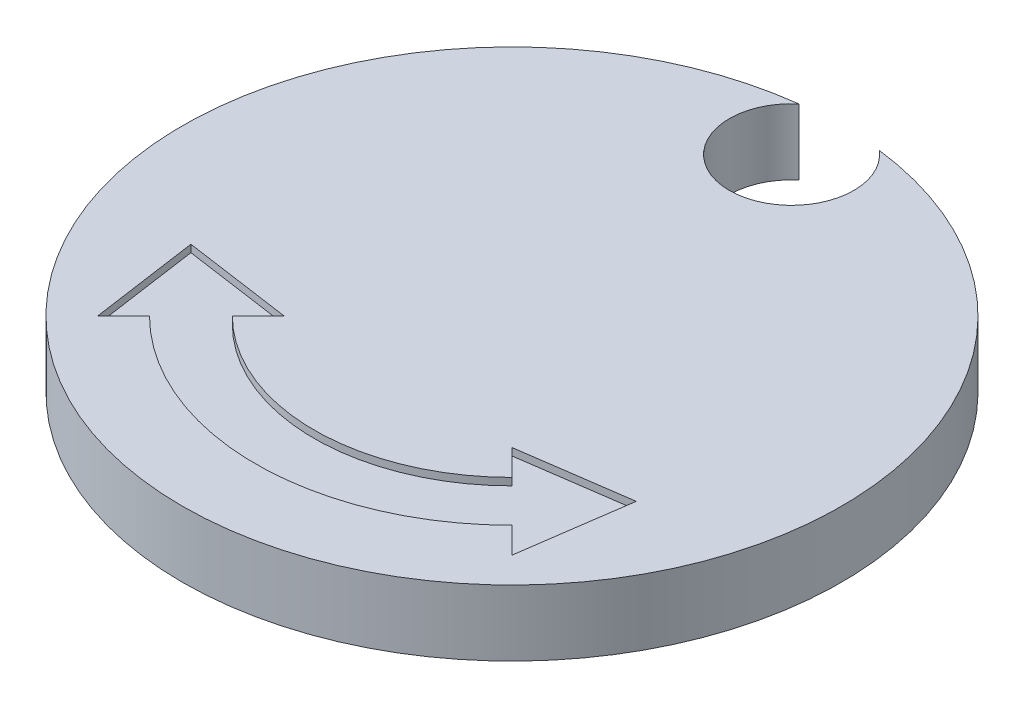
ISO-10303-21;
HEADER;
FILE_DESCRIPTION(('STEP AP214'),'2;1');
FILE_NAME('part.step','',(''),(''),'','','');
FILE_SCHEMA(('AUTOMOTIVE_DESIGN { 1 0 10303 214 1 1 1 1 }'));
ENDSEC;
DATA;
#1=APPLICATION_CONTEXT('core data for automotive mechanical design processes');
#2=APPLICATION_PROTOCOL_DEFINITION('international standard','automotive_design',2000,#1);
#3=PRODUCT_CONTEXT('',#1,'mechanical');
#4=PRODUCT('Part','Part','',(#3));
#5=PRODUCT_RELATED_PRODUCT_CATEGORY('part','',(#4));
#6=PRODUCT_DEFINITION_FORMATION('','',#4);
#7=PRODUCT_DEFINITION_CONTEXT('part definition',#1,'design');
#8=PRODUCT_DEFINITION('design','',#6,#7);
#9=PRODUCT_DEFINITION_SHAPE('','',#8);
#10=(LENGTH_UNIT() NAMED_UNIT(*) SI_UNIT(.MILLI.,.METRE.));
#11=(NAMED_UNIT(*) PLANE_ANGLE_UNIT() SI_UNIT($,.RADIAN.));
#12=(NAMED_UNIT(*) SI_UNIT($,.STERADIAN.) SOLID_ANGLE_UNIT());
#13=UNCERTAINTY_MEASURE_WITH_UNIT(LENGTH_MEASURE(1.E-05),#10,'distance_accuracy_value','');
#14=(GEOMETRIC_REPRESENTATION_CONTEXT(3) GLOBAL_UNCERTAINTY_ASSIGNED_CONTEXT((#13)) GLOBAL_UNIT_ASSIGNED_CONTEXT((#10,
#11,#12)) REPRESENTATION_CONTEXT('',''));
#15=CARTESIAN_POINT('',(0.,0.,0.));
#16=DIRECTION('',(0.,0.,1.));
#17=DIRECTION('',(1.,0.,0.));
#18=AXIS2_PLACEMENT_3D('',#15,#16,#17);
#19=CARTESIAN_POINT('',(0.,9.,0.));
#20=DIRECTION('',(0.,-1.,0.));
#21=DIRECTION('',(0.,0.,-1.));
#22=AXIS2_PLACEMENT_3D('',#19,#20,#21);
#23=CYLINDRICAL_SURFACE('',#22,45.);
#24=CARTESIAN_POINT('',(0.,0.,0.));
#25=DIRECTION('',(0.,1.,0.));
#26=DIRECTION('',(0.,0.,1.));
#27=AXIS2_PLACEMENT_3D('',#24,#25,#26);
#28=CIRCLE('',#27,45.);
#29=CARTESIAN_POINT('',(-5.49999999999999,0.,-44.6626241951814));
#30=VERTEX_POINT('',#29);
#31=CARTESIAN_POINT('',(5.49999999999999,0.,-44.6626241951814));
#32=VERTEX_POINT('',#31);
#33=EDGE_CURVE('E270',#30,#32,#28,.T.);
#34=ORIENTED_EDGE('',*,*,#33,.T.);
#35=DIRECTION('',(0.,1.,0.));
#36=VECTOR('',#35,1.);
#37=CARTESIAN_POINT('',(5.5,4.,-44.6626241951814));
#38=LINE('',#37,#36);
#39=CARTESIAN_POINT('',(5.5,9.,-44.6626241951814));
#40=VERTEX_POINT('',#39);
#41=EDGE_CURVE('E67',#32,#40,#38,.T.);
#42=ORIENTED_EDGE('',*,*,#41,.T.);
#43=CARTESIAN_POINT('',(0.,9.,0.));
#44=DIRECTION('',(0.,1.,0.));
#45=DIRECTION('',(0.,0.,1.));
#46=AXIS2_PLACEMENT_3D('',#43,#44,#45);
#47=CIRCLE('',#46,45.);
#48=CARTESIAN_POINT('',(-5.5,9.,-44.6626241951814));
#49=VERTEX_POINT('',#48);
#50=EDGE_CURVE('E271',#49,#40,#47,.T.);
#51=ORIENTED_EDGE('',*,*,#50,.F.);
#52=DIRECTION('',(0.,1.,0.));
#53=VECTOR('',#52,1.);
#54=CARTESIAN_POINT('',(-5.5,4.,-44.6626241951814));
#55=LINE('',#54,#53);
#56=EDGE_CURVE('E264',#49,#30,#55,.F.);
#57=ORIENTED_EDGE('',*,*,#56,.T.);
#58=EDGE_LOOP('',(#34,#42,#51,#57));
#59=FACE_BOUND('',#58,.T.);
#60=ADVANCED_FACE('F44',(#59),#23,.T.);
#61=CARTESIAN_POINT('',(0.,9.,0.));
#62=DIRECTION('',(0.,1.,0.));
#63=DIRECTION('',(0.,0.,1.));
#64=AXIS2_PLACEMENT_3D('',#61,#62,#63);
#65=PLANE('',#64);
#66=CARTESIAN_POINT('',(0.,9.,0.));
#67=DIRECTION('',(0.,-1.,0.));
#68=DIRECTION('',(0.,0.,1.));
#69=AXIS2_PLACEMENT_3D('',#66,#67,#68);
#70=CIRCLE('',#69,27.);
#71=CARTESIAN_POINT('',(19.0918809500532,9.,19.0918852340201));
#72=VERTEX_POINT('',#71);
#73=CARTESIAN_POINT('',(-19.0918830920368,9.,19.0918830920368));
#74=VERTEX_POINT('',#73);
#75=EDGE_CURVE('E59',#72,#74,#70,.T.);
#76=ORIENTED_EDGE('',*,*,#75,.F.);
#77=DIRECTION('',(0.70710678118654,0.,0.707106781186555));
#78=VECTOR('',#77,1.);
#79=CARTESIAN_POINT('',(19.0918809500532,9.,19.0918852340201));
#80=LINE('',#79,#78);
#81=CARTESIAN_POINT('',(15.5563470441205,9.,15.5563513280873));
#82=VERTEX_POINT('',#81);
#83=EDGE_CURVE('E157',#82,#72,#80,.T.);
#84=ORIENTED_EDGE('',*,*,#83,.F.);
#85=DIRECTION('',(-0.989949493661168,0.,0.141421356237297));
#86=VECTOR('',#85,1.);
#87=CARTESIAN_POINT('',(15.5563470441205,9.,15.5563513280873));
#88=LINE('',#87,#86);
#89=CARTESIAN_POINT('',(30.4055894490381,9.,13.4350309845279));
#90=VERTEX_POINT('',#89);
#91=EDGE_CURVE('E161',#90,#82,#88,.T.);
#92=ORIENTED_EDGE('',*,*,#91,.F.);
#93=DIRECTION('',(0.141421356237319,0.,-0.989949493661165));
#94=VECTOR('',#93,1.);
#95=CARTESIAN_POINT('',(30.4055894490381,9.,13.4350309845279));
#96=LINE('',#95,#94);
#97=CARTESIAN_POINT('',(28.2842691054783,9.,28.2842733894454));
#98=VERTEX_POINT('',#97);
#99=EDGE_CURVE('E216',#98,#90,#96,.T.);
#100=ORIENTED_EDGE('',*,*,#99,.F.);
#101=DIRECTION('',(0.70710678118654,0.,0.707106781186556));
#102=VECTOR('',#101,1.);
#103=CARTESIAN_POINT('',(28.2842691054783,9.,28.2842733894454));
#104=LINE('',#103,#102);
#105=CARTESIAN_POINT('',(24.7487351995456,9.,24.7487394835126));
#106=VERTEX_POINT('',#105);
#107=EDGE_CURVE('E212',#106,#98,#104,.T.);
#108=ORIENTED_EDGE('',*,*,#107,.F.);
#109=CARTESIAN_POINT('',(0.,9.,0.));
#110=DIRECTION('',(0.,1.,0.));
#111=DIRECTION('',(0.,0.,1.));
#112=AXIS2_PLACEMENT_3D('',#109,#110,#111);
#113=CIRCLE('',#112,35.);
#114=CARTESIAN_POINT('',(-24.7487373415292,9.,24.7487373415291));
#115=VERTEX_POINT('',#114);
#116=EDGE_CURVE('E208',#115,#106,#113,.T.);
#117=ORIENTED_EDGE('',*,*,#116,.F.);
#118=DIRECTION('',(0.707106781186547,0.,-0.707106781186547));
#119=VECTOR('',#118,1.);
#120=CARTESIAN_POINT('',(-24.7487373415292,9.,24.7487373415291));
#121=LINE('',#120,#119);
#122=CARTESIAN_POINT('',(-28.2842712474619,9.,28.2842712474619));
#123=VERTEX_POINT('',#122);
#124=EDGE_CURVE('E204',#123,#115,#121,.T.);
#125=ORIENTED_EDGE('',*,*,#124,.F.);
#126=DIRECTION('',(0.141421356237307,0.,0.989949493661167));
#127=VECTOR('',#126,1.);
#128=CARTESIAN_POINT('',(-28.2842712474619,9.,28.2842712474619));
#129=LINE('',#128,#127);
#130=CARTESIAN_POINT('',(-30.4055915910215,9.,13.4350288425443));
#131=VERTEX_POINT('',#130);
#132=EDGE_CURVE('E200',#131,#123,#129,.T.);
#133=ORIENTED_EDGE('',*,*,#132,.F.);
#134=DIRECTION('',(-0.989949493661166,0.,-0.141421356237313));
#135=VECTOR('',#134,1.);
#136=CARTESIAN_POINT('',(-30.4055915910215,9.,13.4350288425443));
#137=LINE('',#136,#135);
#138=CARTESIAN_POINT('',(-15.5563491861041,9.,15.556349186104));
#139=VERTEX_POINT('',#138);
#140=EDGE_CURVE('E196',#139,#131,#137,.T.);
#141=ORIENTED_EDGE('',*,*,#140,.F.);
#142=DIRECTION('',(0.707106781186548,0.,-0.707106781186547));
#143=VECTOR('',#142,1.);
#144=CARTESIAN_POINT('',(-15.5563491861041,9.,15.556349186104));
#145=LINE('',#144,#143);
#146=EDGE_CURVE('E193',#74,#139,#145,.T.);
#147=ORIENTED_EDGE('',*,*,#146,.F.);
#148=EDGE_LOOP('',(#76,#84,#92,#100,#108,#117,#125,#133,#141,#147));
#149=FACE_BOUND('',#148,.T.);
#150=CARTESIAN_POINT('',(0.,9.,-38.1818834967735));
#151=DIRECTION('',(0.,1.,0.));
#152=DIRECTION('',(0.,0.,1.));
#153=AXIS2_PLACEMENT_3D('',#150,#151,#152);
#154=CIRCLE('',#153,8.5);
#155=EDGE_CURVE('E261',#49,#40,#154,.T.);
#156=ORIENTED_EDGE('',*,*,#155,.F.);
#157=ORIENTED_EDGE('',*,*,#50,.T.);
#158=EDGE_LOOP('',(#156,#157));
#159=FACE_BOUND('',#158,.T.);
#160=ADVANCED_FACE('F286',(#149,#159),#65,.T.);
#161=CARTESIAN_POINT('',(0.,0.,0.));
#162=DIRECTION('',(0.,1.,0.));
#163=DIRECTION('',(0.,0.,1.));
#164=AXIS2_PLACEMENT_3D('',#161,#162,#163);
#165=PLANE('',#164);
#166=CARTESIAN_POINT('',(0.,0.,0.));
#167=DIRECTION('',(0.,1.,0.));
#168=DIRECTION('',(0.,0.,1.));
#169=AXIS2_PLACEMENT_3D('',#166,#167,#168);
#170=CIRCLE('',#169,3.);
#171=CARTESIAN_POINT('',(0.,0.,3.));
#172=VERTEX_POINT('',#171);
#173=EDGE_CURVE('E11',#172,#172,#170,.F.);
#174=ORIENTED_EDGE('',*,*,#173,.F.);
#175=EDGE_LOOP('',(#174));
#176=FACE_BOUND('',#175,.T.);
#177=ORIENTED_EDGE('',*,*,#33,.F.);
#178=CARTESIAN_POINT('',(0.,0.,-38.1818834967735));
#179=DIRECTION('',(0.,1.,0.));
#180=DIRECTION('',(0.,0.,1.));
#181=AXIS2_PLACEMENT_3D('',#178,#179,#180);
#182=CIRCLE('',#181,8.5);
#183=EDGE_CURVE('E52',#30,#32,#182,.T.);
#184=ORIENTED_EDGE('',*,*,#183,.T.);
#185=EDGE_LOOP('',(#177,#184));
#186=FACE_BOUND('',#185,.T.);
#187=ADVANCED_FACE('F280',(#176,#186),#165,.F.);
#188=CARTESIAN_POINT('',(0.,-1.,-38.1818834967735));
#189=DIRECTION('',(0.,1.,0.));
#190=DIRECTION('',(0.,0.,1.));
#191=AXIS2_PLACEMENT_3D('',#188,#189,#190);
#192=CYLINDRICAL_SURFACE('',#191,8.5);
#193=ORIENTED_EDGE('',*,*,#183,.F.);
#194=ORIENTED_EDGE('',*,*,#56,.F.);
#195=ORIENTED_EDGE('',*,*,#155,.T.);
#196=ORIENTED_EDGE('',*,*,#41,.F.);
#197=EDGE_LOOP('',(#193,#194,#195,#196));
#198=FACE_BOUND('',#197,.T.);
#199=ADVANCED_FACE('F284',(#198),#192,.F.);
#200=CARTESIAN_POINT('',(0.,-6.,0.));
#201=DIRECTION('',(0.,1.,0.));
#202=DIRECTION('',(0.,0.,1.));
#203=AXIS2_PLACEMENT_3D('',#200,#201,#202);
#204=CYLINDRICAL_SURFACE('',#203,3.);
#205=CARTESIAN_POINT('',(0.,-6.,0.));
#206=DIRECTION('',(0.,-1.,0.));
#207=DIRECTION('',(0.,0.,-1.));
#208=AXIS2_PLACEMENT_3D('',#205,#206,#207);
#209=CIRCLE('',#208,3.);
#210=CARTESIAN_POINT('',(0.,-6.,-3.));
#211=VERTEX_POINT('',#210);
#212=EDGE_CURVE('E254',#211,#211,#209,.T.);
#213=ORIENTED_EDGE('',*,*,#212,.F.);
#214=EDGE_LOOP('',(#213));
#215=FACE_BOUND('',#214,.T.);
#216=ORIENTED_EDGE('',*,*,#173,.T.);
#217=EDGE_LOOP('',(#216));
#218=FACE_BOUND('',#217,.T.);
#219=ADVANCED_FACE('F300',(#215,#218),#204,.T.);
#220=CARTESIAN_POINT('',(0.,-6.,0.));
#221=DIRECTION('',(0.,-1.,0.));
#222=DIRECTION('',(0.,0.,-1.));
#223=AXIS2_PLACEMENT_3D('',#220,#221,#222);
#224=PLANE('',#223);
#225=CARTESIAN_POINT('',(0.,-6.,0.));
#226=DIRECTION('',(0.,-1.,0.));
#227=DIRECTION('',(0.,0.,-1.));
#228=AXIS2_PLACEMENT_3D('',#225,#226,#227);
#229=CIRCLE('',#228,2.5);
#230=CARTESIAN_POINT('',(0.,-6.,-2.5));
#231=VERTEX_POINT('',#230);
#232=EDGE_CURVE('E226',#231,#231,#229,.T.);
#233=ORIENTED_EDGE('',*,*,#232,.F.);
#234=EDGE_LOOP('',(#233));
#235=FACE_BOUND('',#234,.T.);
#236=ORIENTED_EDGE('',*,*,#212,.T.);
#237=EDGE_LOOP('',(#236));
#238=FACE_BOUND('',#237,.T.);
#239=ADVANCED_FACE('F303',(#235,#238),#224,.T.);
#240=CARTESIAN_POINT('',(0.,-1.,0.));
#241=DIRECTION('',(0.,-1.,0.));
#242=DIRECTION('',(0.,0.,-1.));
#243=AXIS2_PLACEMENT_3D('',#240,#241,#242);
#244=CYLINDRICAL_SURFACE('',#243,2.5);
#245=CARTESIAN_POINT('',(0.,-1.,0.));
#246=DIRECTION('',(0.,-1.,0.));
#247=DIRECTION('',(0.,0.,-1.));
#248=AXIS2_PLACEMENT_3D('',#245,#246,#247);
#249=CIRCLE('',#248,2.5);
#250=CARTESIAN_POINT('',(0.,-1.,-2.5));
#251=VERTEX_POINT('',#250);
#252=EDGE_CURVE('E250',#251,#251,#249,.T.);
#253=ORIENTED_EDGE('',*,*,#252,.F.);
#254=EDGE_LOOP('',(#253));
#255=FACE_BOUND('',#254,.T.);
#256=ORIENTED_EDGE('',*,*,#232,.T.);
#257=EDGE_LOOP('',(#256));
#258=FACE_BOUND('',#257,.T.);
#259=ADVANCED_FACE('F307',(#255,#258),#244,.F.);
#260=CARTESIAN_POINT('',(0.,-1.,0.));
#261=DIRECTION('',(0.,-1.,0.));
#262=DIRECTION('',(0.,0.,-1.));
#263=AXIS2_PLACEMENT_3D('',#260,#261,#262);
#264=PLANE('',#263);
#265=ORIENTED_EDGE('',*,*,#252,.T.);
#266=EDGE_LOOP('',(#265));
#267=FACE_BOUND('',#266,.T.);
#268=ADVANCED_FACE('F311',(#267),#264,.T.);
#269=CARTESIAN_POINT('',(0.,8.,0.));
#270=DIRECTION('',(0.,1.,0.));
#271=DIRECTION('',(0.,0.,1.));
#272=AXIS2_PLACEMENT_3D('',#269,#270,#271);
#273=CYLINDRICAL_SURFACE('',#272,27.);
#274=ORIENTED_EDGE('',*,*,#75,.T.);
#275=DIRECTION('',(0.,1.,0.));
#276=VECTOR('',#275,1.);
#277=CARTESIAN_POINT('',(-19.0918830920368,8.,19.0918830920368));
#278=LINE('',#277,#276);
#279=CARTESIAN_POINT('',(-19.0918830920368,8.,19.0918830920368));
#280=VERTEX_POINT('',#279);
#281=EDGE_CURVE('E131',#280,#74,#278,.T.);
#282=ORIENTED_EDGE('',*,*,#281,.F.);
#283=CARTESIAN_POINT('',(0.,8.,0.));
#284=DIRECTION('',(0.,-1.,0.));
#285=DIRECTION('',(0.,0.,1.));
#286=AXIS2_PLACEMENT_3D('',#283,#284,#285);
#287=CIRCLE('',#286,27.);
#288=CARTESIAN_POINT('',(19.0918809500532,8.,19.0918852340201));
#289=VERTEX_POINT('',#288);
#290=EDGE_CURVE('E135',#289,#280,#287,.T.);
#291=ORIENTED_EDGE('',*,*,#290,.F.);
#292=DIRECTION('',(0.,1.,0.));
#293=VECTOR('',#292,1.);
#294=CARTESIAN_POINT('',(19.0918809500532,8.,19.0918852340201));
#295=LINE('',#294,#293);
#296=EDGE_CURVE('E223',#289,#72,#295,.T.);
#297=ORIENTED_EDGE('',*,*,#296,.T.);
#298=EDGE_LOOP('',(#274,#282,#291,#297));
#299=FACE_BOUND('',#298,.T.);
#300=ADVANCED_FACE('F133',(#299),#273,.T.);
#301=CARTESIAN_POINT('',(19.0918809500532,8.,19.0918852340201));
#302=DIRECTION('',(-0.707106781186555,0.,0.70710678118654));
#303=DIRECTION('',(0.70710678118654,0.,0.707106781186555));
#304=AXIS2_PLACEMENT_3D('',#301,#302,#303);
#305=PLANE('',#304);
#306=ORIENTED_EDGE('',*,*,#83,.T.);
#307=ORIENTED_EDGE('',*,*,#296,.F.);
#308=DIRECTION('',(0.70710678118654,0.,0.707106781186555));
#309=VECTOR('',#308,1.);
#310=CARTESIAN_POINT('',(19.0918809500532,8.,19.0918852340201));
#311=LINE('',#310,#309);
#312=CARTESIAN_POINT('',(15.5563470441205,8.,15.5563513280873));
#313=VERTEX_POINT('',#312);
#314=EDGE_CURVE('E142',#313,#289,#311,.T.);
#315=ORIENTED_EDGE('',*,*,#314,.F.);
#316=DIRECTION('',(0.,1.,0.));
#317=VECTOR('',#316,1.);
#318=CARTESIAN_POINT('',(15.5563470441205,8.,15.5563513280873));
#319=LINE('',#318,#317);
#320=EDGE_CURVE('E227',#313,#82,#319,.T.);
#321=ORIENTED_EDGE('',*,*,#320,.T.);
#322=EDGE_LOOP('',(#306,#307,#315,#321));
#323=FACE_BOUND('',#322,.T.);
#324=ADVANCED_FACE('F316',(#323),#305,.F.);
#325=CARTESIAN_POINT('',(15.5563470441205,8.,15.5563513280873));
#326=DIRECTION('',(-0.141421356237297,0.,-0.989949493661168));
#327=DIRECTION('',(-0.989949493661168,0.,0.141421356237297));
#328=AXIS2_PLACEMENT_3D('',#325,#326,#327);
#329=PLANE('',#328);
#330=ORIENTED_EDGE('',*,*,#91,.T.);
#331=ORIENTED_EDGE('',*,*,#320,.F.);
#332=DIRECTION('',(-0.989949493661168,0.,0.141421356237297));
#333=VECTOR('',#332,1.);
#334=CARTESIAN_POINT('',(15.5563470441205,8.,15.5563513280873));
#335=LINE('',#334,#333);
#336=CARTESIAN_POINT('',(30.4055894490381,8.,13.4350309845279));
#337=VERTEX_POINT('',#336);
#338=EDGE_CURVE('E186',#337,#313,#335,.T.);
#339=ORIENTED_EDGE('',*,*,#338,.F.);
#340=DIRECTION('',(0.,1.,0.));
#341=VECTOR('',#340,1.);
#342=CARTESIAN_POINT('',(30.4055894490381,8.,13.4350309845279));
#343=LINE('',#342,#341);
#344=EDGE_CURVE('E230',#337,#90,#343,.T.);
#345=ORIENTED_EDGE('',*,*,#344,.T.);
#346=EDGE_LOOP('',(#330,#331,#339,#345));
#347=FACE_BOUND('',#346,.T.);
#348=ADVANCED_FACE('F342',(#347),#329,.F.);
#349=CARTESIAN_POINT('',(30.4055894490381,8.,13.4350309845279));
#350=DIRECTION('',(0.989949493661165,0.,0.141421356237319));
#351=DIRECTION('',(0.141421356237319,0.,-0.989949493661165));
#352=AXIS2_PLACEMENT_3D('',#349,#350,#351);
#353=PLANE('',#352);
#354=ORIENTED_EDGE('',*,*,#99,.T.);
#355=ORIENTED_EDGE('',*,*,#344,.F.);
#356=DIRECTION('',(0.141421356237319,0.,-0.989949493661165));
#357=VECTOR('',#356,1.);
#358=CARTESIAN_POINT('',(30.4055894490381,8.,13.4350309845279));
#359=LINE('',#358,#357);
#360=CARTESIAN_POINT('',(28.2842691054783,8.,28.2842733894454));
#361=VERTEX_POINT('',#360);
#362=EDGE_CURVE('E182',#361,#337,#359,.T.);
#363=ORIENTED_EDGE('',*,*,#362,.F.);
#364=DIRECTION('',(0.,1.,0.));
#365=VECTOR('',#364,1.);
#366=CARTESIAN_POINT('',(28.2842691054783,8.,28.2842733894454));
#367=LINE('',#366,#365);
#368=EDGE_CURVE('E233',#361,#98,#367,.T.);
#369=ORIENTED_EDGE('',*,*,#368,.T.);
#370=EDGE_LOOP('',(#354,#355,#363,#369));
#371=FACE_BOUND('',#370,.T.);
#372=ADVANCED_FACE('F338',(#371),#353,.F.);
#373=CARTESIAN_POINT('',(28.2842691054783,8.,28.2842733894454));
#374=DIRECTION('',(-0.707106781186556,0.,0.70710678118654));
#375=DIRECTION('',(0.70710678118654,0.,0.707106781186556));
#376=AXIS2_PLACEMENT_3D('',#373,#374,#375);
#377=PLANE('',#376);
#378=ORIENTED_EDGE('',*,*,#107,.T.);
#379=ORIENTED_EDGE('',*,*,#368,.F.);
#380=DIRECTION('',(0.70710678118654,0.,0.707106781186556));
#381=VECTOR('',#380,1.);
#382=CARTESIAN_POINT('',(28.2842691054783,8.,28.2842733894454));
#383=LINE('',#382,#381);
#384=CARTESIAN_POINT('',(24.7487351995456,8.,24.7487394835126));
#385=VERTEX_POINT('',#384);
#386=EDGE_CURVE('E178',#385,#361,#383,.T.);
#387=ORIENTED_EDGE('',*,*,#386,.F.);
#388=DIRECTION('',(0.,1.,0.));
#389=VECTOR('',#388,1.);
#390=CARTESIAN_POINT('',(24.7487351995456,8.,24.7487394835126));
#391=LINE('',#390,#389);
#392=EDGE_CURVE('E236',#385,#106,#391,.T.);
#393=ORIENTED_EDGE('',*,*,#392,.T.);
#394=EDGE_LOOP('',(#378,#379,#387,#393));
#395=FACE_BOUND('',#394,.T.);
#396=ADVANCED_FACE('F334',(#395),#377,.F.);
#397=CARTESIAN_POINT('',(0.,8.,0.));
#398=DIRECTION('',(0.,1.,0.));
#399=DIRECTION('',(0.,0.,1.));
#400=AXIS2_PLACEMENT_3D('',#397,#398,#399);
#401=CYLINDRICAL_SURFACE('',#400,35.);
#402=ORIENTED_EDGE('',*,*,#116,.T.);
#403=ORIENTED_EDGE('',*,*,#392,.F.);
#404=CARTESIAN_POINT('',(0.,8.,0.));
#405=DIRECTION('',(0.,1.,0.));
#406=DIRECTION('',(0.,0.,1.));
#407=AXIS2_PLACEMENT_3D('',#404,#405,#406);
#408=CIRCLE('',#407,35.);
#409=CARTESIAN_POINT('',(-24.7487373415292,8.,24.7487373415291));
#410=VERTEX_POINT('',#409);
#411=EDGE_CURVE('E174',#410,#385,#408,.T.);
#412=ORIENTED_EDGE('',*,*,#411,.F.);
#413=DIRECTION('',(0.,1.,0.));
#414=VECTOR('',#413,1.);
#415=CARTESIAN_POINT('',(-24.7487373415292,8.,24.7487373415291));
#416=LINE('',#415,#414);
#417=EDGE_CURVE('E239',#410,#115,#416,.T.);
#418=ORIENTED_EDGE('',*,*,#417,.T.);
#419=EDGE_LOOP('',(#402,#403,#412,#418));
#420=FACE_BOUND('',#419,.T.);
#421=ADVANCED_FACE('F330',(#420),#401,.F.);
#422=CARTESIAN_POINT('',(-24.7487373415292,8.,24.7487373415291));
#423=DIRECTION('',(0.707106781186547,0.,0.707106781186547));
#424=DIRECTION('',(0.707106781186548,0.,-0.707106781186548));
#425=AXIS2_PLACEMENT_3D('',#422,#423,#424);
#426=PLANE('',#425);
#427=ORIENTED_EDGE('',*,*,#124,.T.);
#428=ORIENTED_EDGE('',*,*,#417,.F.);
#429=DIRECTION('',(0.707106781186547,0.,-0.707106781186547));
#430=VECTOR('',#429,1.);
#431=CARTESIAN_POINT('',(-24.7487373415292,8.,24.7487373415291));
#432=LINE('',#431,#430);
#433=CARTESIAN_POINT('',(-28.2842712474619,8.,28.2842712474619));
#434=VERTEX_POINT('',#433);
#435=EDGE_CURVE('E170',#434,#410,#432,.T.);
#436=ORIENTED_EDGE('',*,*,#435,.F.);
#437=DIRECTION('',(0.,1.,0.));
#438=VECTOR('',#437,1.);
#439=CARTESIAN_POINT('',(-28.2842712474619,8.,28.2842712474619));
#440=LINE('',#439,#438);
#441=EDGE_CURVE('E242',#434,#123,#440,.T.);
#442=ORIENTED_EDGE('',*,*,#441,.T.);
#443=EDGE_LOOP('',(#427,#428,#436,#442));
#444=FACE_BOUND('',#443,.T.);
#445=ADVANCED_FACE('F326',(#444),#426,.F.);
#446=CARTESIAN_POINT('',(-28.2842712474619,8.,28.2842712474619));
#447=DIRECTION('',(-0.989949493661167,0.,0.141421356237307));
#448=DIRECTION('',(0.141421356237307,0.,0.989949493661167));
#449=AXIS2_PLACEMENT_3D('',#446,#447,#448);
#450=PLANE('',#449);
#451=ORIENTED_EDGE('',*,*,#132,.T.);
#452=ORIENTED_EDGE('',*,*,#441,.F.);
#453=DIRECTION('',(0.141421356237307,0.,0.989949493661167));
#454=VECTOR('',#453,1.);
#455=CARTESIAN_POINT('',(-28.2842712474619,8.,28.2842712474619));
#456=LINE('',#455,#454);
#457=CARTESIAN_POINT('',(-30.4055915910215,8.,13.4350288425443));
#458=VERTEX_POINT('',#457);
#459=EDGE_CURVE('E166',#458,#434,#456,.T.);
#460=ORIENTED_EDGE('',*,*,#459,.F.);
#461=DIRECTION('',(0.,1.,0.));
#462=VECTOR('',#461,1.);
#463=CARTESIAN_POINT('',(-30.4055915910215,8.,13.4350288425443));
#464=LINE('',#463,#462);
#465=EDGE_CURVE('E245',#458,#131,#464,.T.);
#466=ORIENTED_EDGE('',*,*,#465,.T.);
#467=EDGE_LOOP('',(#451,#452,#460,#466));
#468=FACE_BOUND('',#467,.T.);
#469=ADVANCED_FACE('F322',(#468),#450,.F.);
#470=CARTESIAN_POINT('',(-30.4055915910215,8.,13.4350288425443));
#471=DIRECTION('',(0.141421356237313,0.,-0.989949493661166));
#472=DIRECTION('',(-0.989949493661166,0.,-0.141421356237313));
#473=AXIS2_PLACEMENT_3D('',#470,#471,#472);
#474=PLANE('',#473);
#475=ORIENTED_EDGE('',*,*,#140,.T.);
#476=ORIENTED_EDGE('',*,*,#465,.F.);
#477=DIRECTION('',(-0.989949493661166,0.,-0.141421356237313));
#478=VECTOR('',#477,1.);
#479=CARTESIAN_POINT('',(-30.4055915910215,8.,13.4350288425443));
#480=LINE('',#479,#478);
#481=CARTESIAN_POINT('',(-15.5563491861041,8.,15.556349186104));
#482=VERTEX_POINT('',#481);
#483=EDGE_CURVE('E151',#482,#458,#480,.T.);
#484=ORIENTED_EDGE('',*,*,#483,.F.);
#485=DIRECTION('',(0.,1.,0.));
#486=VECTOR('',#485,1.);
#487=CARTESIAN_POINT('',(-15.5563491861041,8.,15.556349186104));
#488=LINE('',#487,#486);
#489=EDGE_CURVE('E141',#482,#139,#488,.T.);
#490=ORIENTED_EDGE('',*,*,#489,.T.);
#491=EDGE_LOOP('',(#475,#476,#484,#490));
#492=FACE_BOUND('',#491,.T.);
#493=ADVANCED_FACE('F319',(#492),#474,.F.);
#494=CARTESIAN_POINT('',(-15.5563491861041,8.,15.556349186104));
#495=DIRECTION('',(0.707106781186547,0.,0.707106781186548));
#496=DIRECTION('',(0.707106781186548,0.,-0.707106781186547));
#497=AXIS2_PLACEMENT_3D('',#494,#495,#496);
#498=PLANE('',#497);
#499=ORIENTED_EDGE('',*,*,#146,.T.);
#500=ORIENTED_EDGE('',*,*,#489,.F.);
#501=DIRECTION('',(0.707106781186548,0.,-0.707106781186547));
#502=VECTOR('',#501,1.);
#503=CARTESIAN_POINT('',(-15.5563491861041,8.,15.556349186104));
#504=LINE('',#503,#502);
#505=EDGE_CURVE('E145',#280,#482,#504,.T.);
#506=ORIENTED_EDGE('',*,*,#505,.F.);
#507=ORIENTED_EDGE('',*,*,#281,.T.);
#508=EDGE_LOOP('',(#499,#500,#506,#507));
#509=FACE_BOUND('',#508,.T.);
#510=ADVANCED_FACE('F146',(#509),#498,.F.);
#511=CARTESIAN_POINT('',(0.,8.,0.));
#512=DIRECTION('',(0.,1.,0.));
#513=DIRECTION('',(0.,0.,1.));
#514=AXIS2_PLACEMENT_3D('',#511,#512,#513);
#515=PLANE('',#514);
#516=ORIENTED_EDGE('',*,*,#290,.T.);
#517=ORIENTED_EDGE('',*,*,#505,.T.);
#518=ORIENTED_EDGE('',*,*,#483,.T.);
#519=ORIENTED_EDGE('',*,*,#459,.T.);
#520=ORIENTED_EDGE('',*,*,#435,.T.);
#521=ORIENTED_EDGE('',*,*,#411,.T.);
#522=ORIENTED_EDGE('',*,*,#386,.T.);
#523=ORIENTED_EDGE('',*,*,#362,.T.);
#524=ORIENTED_EDGE('',*,*,#338,.T.);
#525=ORIENTED_EDGE('',*,*,#314,.T.);
#526=EDGE_LOOP('',(#516,#517,#518,#519,#520,#521,#522,#523,#524,#525));
#527=FACE_BOUND('',#526,.T.);
#528=ADVANCED_FACE('F153',(#527),#515,.T.);
#529=CLOSED_SHELL('',(#60,#160,#187,#199,#219,#239,#259,#268,#300,#324,#348,#372,#396,#421,#445,
#469,#493,#510,#528));
#530=MANIFOLD_SOLID_BREP('B2',#529);
#531=ADVANCED_BREP_SHAPE_REPRESENTATION('',(#18,#530),#14);
#532=SHAPE_DEFINITION_REPRESENTATION(#9,#531);
ENDSEC;
END-ISO-10303-21;
